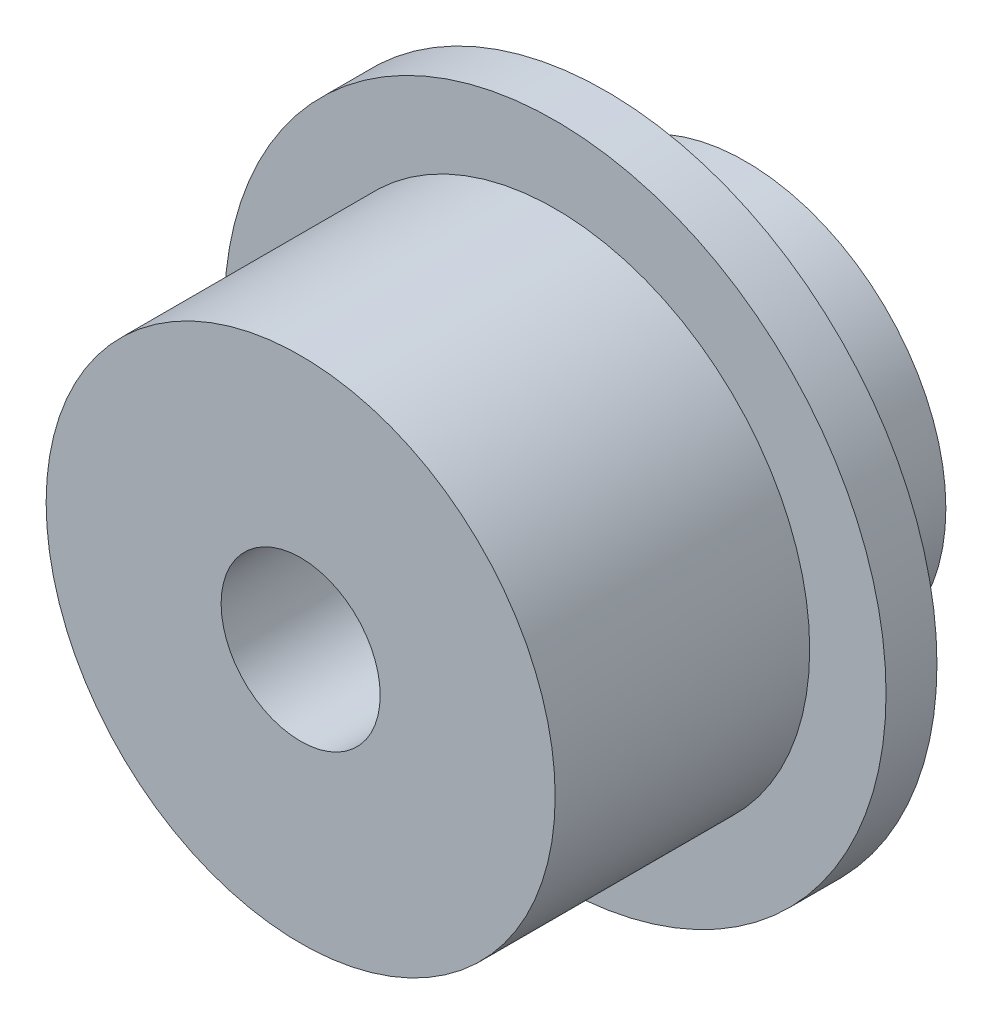
ISO-10303-21;
HEADER;
FILE_DESCRIPTION(('STEP AP214'),'2;1');
FILE_NAME('part.step','',(''),(''),'','','');
FILE_SCHEMA(('AUTOMOTIVE_DESIGN { 1 0 10303 214 1 1 1 1 }'));
ENDSEC;
DATA;
#1=APPLICATION_CONTEXT('core data for automotive mechanical design processes');
#2=APPLICATION_PROTOCOL_DEFINITION('international standard','automotive_design',2000,#1);
#3=PRODUCT_CONTEXT('',#1,'mechanical');
#4=PRODUCT('Part','Part','',(#3));
#5=PRODUCT_RELATED_PRODUCT_CATEGORY('part','',(#4));
#6=PRODUCT_DEFINITION_FORMATION('','',#4);
#7=PRODUCT_DEFINITION_CONTEXT('part definition',#1,'design');
#8=PRODUCT_DEFINITION('design','',#6,#7);
#9=PRODUCT_DEFINITION_SHAPE('','',#8);
#10=(LENGTH_UNIT() NAMED_UNIT(*) SI_UNIT(.MILLI.,.METRE.));
#11=(NAMED_UNIT(*) PLANE_ANGLE_UNIT() SI_UNIT($,.RADIAN.));
#12=(NAMED_UNIT(*) SI_UNIT($,.STERADIAN.) SOLID_ANGLE_UNIT());
#13=UNCERTAINTY_MEASURE_WITH_UNIT(LENGTH_MEASURE(1.E-05),#10,'distance_accuracy_value','');
#14=(GEOMETRIC_REPRESENTATION_CONTEXT(3) GLOBAL_UNCERTAINTY_ASSIGNED_CONTEXT((#13)) GLOBAL_UNIT_ASSIGNED_CONTEXT((#10,
#11,#12)) REPRESENTATION_CONTEXT('',''));
#15=CARTESIAN_POINT('',(0.,0.,0.));
#16=DIRECTION('',(0.,0.,1.));
#17=DIRECTION('',(1.,0.,0.));
#18=AXIS2_PLACEMENT_3D('',#15,#16,#17);
#19=CARTESIAN_POINT('',(0.,0.,6.9596));
#20=DIRECTION('',(0.,0.,-1.));
#21=DIRECTION('',(-1.,0.,0.));
#22=AXIS2_PLACEMENT_3D('',#19,#20,#21);
#23=CYLINDRICAL_SURFACE('',#22,9.9949);
#24=CARTESIAN_POINT('',(0.,0.,6.9596));
#25=DIRECTION('',(0.,0.,1.));
#26=DIRECTION('',(1.,0.,0.));
#27=AXIS2_PLACEMENT_3D('',#24,#25,#26);
#28=CIRCLE('',#27,9.9949);
#29=CARTESIAN_POINT('',(9.9949,0.,6.9596));
#30=VERTEX_POINT('',#29);
#31=EDGE_CURVE('E40',#30,#30,#28,.T.);
#32=ORIENTED_EDGE('',*,*,#31,.F.);
#33=EDGE_LOOP('',(#32));
#34=FACE_BOUND('',#33,.T.);
#35=CARTESIAN_POINT('',(0.,0.,0.));
#36=DIRECTION('',(0.,0.,1.));
#37=DIRECTION('',(1.,0.,0.));
#38=AXIS2_PLACEMENT_3D('',#35,#36,#37);
#39=CIRCLE('',#38,9.9949);
#40=CARTESIAN_POINT('',(9.9949,0.,0.));
#41=VERTEX_POINT('',#40);
#42=EDGE_CURVE('E36',#41,#41,#39,.T.);
#43=ORIENTED_EDGE('',*,*,#42,.T.);
#44=EDGE_LOOP('',(#43));
#45=FACE_BOUND('',#44,.T.);
#46=ADVANCED_FACE('F33',(#34,#45),#23,.T.);
#47=CARTESIAN_POINT('',(0.,0.,0.));
#48=DIRECTION('',(0.,0.,1.));
#49=DIRECTION('',(1.,0.,0.));
#50=AXIS2_PLACEMENT_3D('',#47,#48,#49);
#51=PLANE('',#50);
#52=CARTESIAN_POINT('',(0.,0.,0.));
#53=DIRECTION('',(0.,0.,-1.));
#54=DIRECTION('',(-1.,0.,0.));
#55=AXIS2_PLACEMENT_3D('',#52,#53,#54);
#56=CIRCLE('',#55,3.96875);
#57=CARTESIAN_POINT('',(-3.96875,0.,0.));
#58=VERTEX_POINT('',#57);
#59=EDGE_CURVE('E61',#58,#58,#56,.T.);
#60=ORIENTED_EDGE('',*,*,#59,.F.);
#61=EDGE_LOOP('',(#60));
#62=FACE_BOUND('',#61,.T.);
#63=ORIENTED_EDGE('',*,*,#42,.F.);
#64=EDGE_LOOP('',(#63));
#65=FACE_BOUND('',#64,.T.);
#66=ADVANCED_FACE('F71',(#62,#65),#51,.F.);
#67=CARTESIAN_POINT('',(0.,0.,9.4996));
#68=DIRECTION('',(0.,0.,-1.));
#69=DIRECTION('',(-1.,0.,0.));
#70=AXIS2_PLACEMENT_3D('',#67,#68,#69);
#71=CYLINDRICAL_SURFACE('',#70,16.51);
#72=CARTESIAN_POINT('',(0.,0.,9.4996));
#73=DIRECTION('',(0.,0.,1.));
#74=DIRECTION('',(1.,0.,0.));
#75=AXIS2_PLACEMENT_3D('',#72,#73,#74);
#76=CIRCLE('',#75,16.51);
#77=CARTESIAN_POINT('',(16.51,0.,9.4996));
#78=VERTEX_POINT('',#77);
#79=EDGE_CURVE('E49',#78,#78,#76,.T.);
#80=ORIENTED_EDGE('',*,*,#79,.F.);
#81=EDGE_LOOP('',(#80));
#82=FACE_BOUND('',#81,.T.);
#83=CARTESIAN_POINT('',(0.,0.,6.9596));
#84=DIRECTION('',(0.,0.,1.));
#85=DIRECTION('',(1.,0.,0.));
#86=AXIS2_PLACEMENT_3D('',#83,#84,#85);
#87=CIRCLE('',#86,16.51);
#88=CARTESIAN_POINT('',(16.51,0.,6.9596));
#89=VERTEX_POINT('',#88);
#90=EDGE_CURVE('E52',#89,#89,#87,.T.);
#91=ORIENTED_EDGE('',*,*,#90,.T.);
#92=EDGE_LOOP('',(#91));
#93=FACE_BOUND('',#92,.T.);
#94=ADVANCED_FACE('F74',(#82,#93),#71,.T.);
#95=CARTESIAN_POINT('',(0.,0.,9.4996));
#96=DIRECTION('',(0.,0.,1.));
#97=DIRECTION('',(1.,0.,0.));
#98=AXIS2_PLACEMENT_3D('',#95,#96,#97);
#99=PLANE('',#98);
#100=CARTESIAN_POINT('',(0.,0.,9.4996));
#101=DIRECTION('',(0.,0.,1.));
#102=DIRECTION('',(1.,0.,0.));
#103=AXIS2_PLACEMENT_3D('',#100,#101,#102);
#104=CIRCLE('',#103,12.7);
#105=CARTESIAN_POINT('',(12.7,0.,9.4996));
#106=VERTEX_POINT('',#105);
#107=EDGE_CURVE('E10',#106,#106,#104,.T.);
#108=ORIENTED_EDGE('',*,*,#107,.F.);
#109=EDGE_LOOP('',(#108));
#110=FACE_BOUND('',#109,.T.);
#111=ORIENTED_EDGE('',*,*,#79,.T.);
#112=EDGE_LOOP('',(#111));
#113=FACE_BOUND('',#112,.T.);
#114=ADVANCED_FACE('F88',(#110,#113),#99,.T.);
#115=CARTESIAN_POINT('',(0.,0.,6.9596));
#116=DIRECTION('',(0.,0.,1.));
#117=DIRECTION('',(1.,0.,0.));
#118=AXIS2_PLACEMENT_3D('',#115,#116,#117);
#119=PLANE('',#118);
#120=ORIENTED_EDGE('',*,*,#31,.T.);
#121=EDGE_LOOP('',(#120));
#122=FACE_BOUND('',#121,.T.);
#123=ORIENTED_EDGE('',*,*,#90,.F.);
#124=EDGE_LOOP('',(#123));
#125=FACE_BOUND('',#124,.T.);
#126=ADVANCED_FACE('F84',(#122,#125),#119,.F.);
#127=CARTESIAN_POINT('',(0.,0.,22.1996));
#128=DIRECTION('',(0.,0.,-1.));
#129=DIRECTION('',(-1.,0.,0.));
#130=AXIS2_PLACEMENT_3D('',#127,#128,#129);
#131=CYLINDRICAL_SURFACE('',#130,12.7);
#132=CARTESIAN_POINT('',(0.,0.,22.1996));
#133=DIRECTION('',(0.,0.,1.));
#134=DIRECTION('',(1.,0.,0.));
#135=AXIS2_PLACEMENT_3D('',#132,#133,#134);
#136=CIRCLE('',#135,12.7);
#137=CARTESIAN_POINT('',(12.7,0.,22.1996));
#138=VERTEX_POINT('',#137);
#139=EDGE_CURVE('E47',#138,#138,#136,.T.);
#140=ORIENTED_EDGE('',*,*,#139,.F.);
#141=EDGE_LOOP('',(#140));
#142=FACE_BOUND('',#141,.T.);
#143=ORIENTED_EDGE('',*,*,#107,.T.);
#144=EDGE_LOOP('',(#143));
#145=FACE_BOUND('',#144,.T.);
#146=ADVANCED_FACE('F87',(#142,#145),#131,.T.);
#147=CARTESIAN_POINT('',(0.,0.,22.1996));
#148=DIRECTION('',(0.,0.,1.));
#149=DIRECTION('',(1.,0.,0.));
#150=AXIS2_PLACEMENT_3D('',#147,#148,#149);
#151=PLANE('',#150);
#152=CARTESIAN_POINT('',(0.,0.,22.1996));
#153=DIRECTION('',(0.,0.,1.));
#154=DIRECTION('',(1.,0.,0.));
#155=AXIS2_PLACEMENT_3D('',#152,#153,#154);
#156=CIRCLE('',#155,3.96875);
#157=CARTESIAN_POINT('',(3.96875,0.,22.1996));
#158=VERTEX_POINT('',#157);
#159=EDGE_CURVE('E57',#158,#158,#156,.F.);
#160=ORIENTED_EDGE('',*,*,#159,.T.);
#161=EDGE_LOOP('',(#160));
#162=FACE_BOUND('',#161,.T.);
#163=ORIENTED_EDGE('',*,*,#139,.T.);
#164=EDGE_LOOP('',(#163));
#165=FACE_BOUND('',#164,.T.);
#166=ADVANCED_FACE('F94',(#162,#165),#151,.T.);
#167=CARTESIAN_POINT('',(0.,0.,33.4249201513364));
#168=DIRECTION('',(0.,0.,-1.));
#169=DIRECTION('',(-1.,0.,0.));
#170=AXIS2_PLACEMENT_3D('',#167,#168,#169);
#171=CYLINDRICAL_SURFACE('',#170,3.96875);
#172=ORIENTED_EDGE('',*,*,#59,.T.);
#173=EDGE_LOOP('',(#172));
#174=FACE_BOUND('',#173,.T.);
#175=ORIENTED_EDGE('',*,*,#159,.F.);
#176=EDGE_LOOP('',(#175));
#177=FACE_BOUND('',#176,.T.);
#178=ADVANCED_FACE('F68',(#174,#177),#171,.F.);
#179=CLOSED_SHELL('',(#46,#66,#94,#114,#126,#146,#166,#178));
#180=MANIFOLD_SOLID_BREP('B2',#179);
#181=ADVANCED_BREP_SHAPE_REPRESENTATION('',(#18,#180),#14);
#182=SHAPE_DEFINITION_REPRESENTATION(#9,#181);
ENDSEC;
END-ISO-10303-21;
